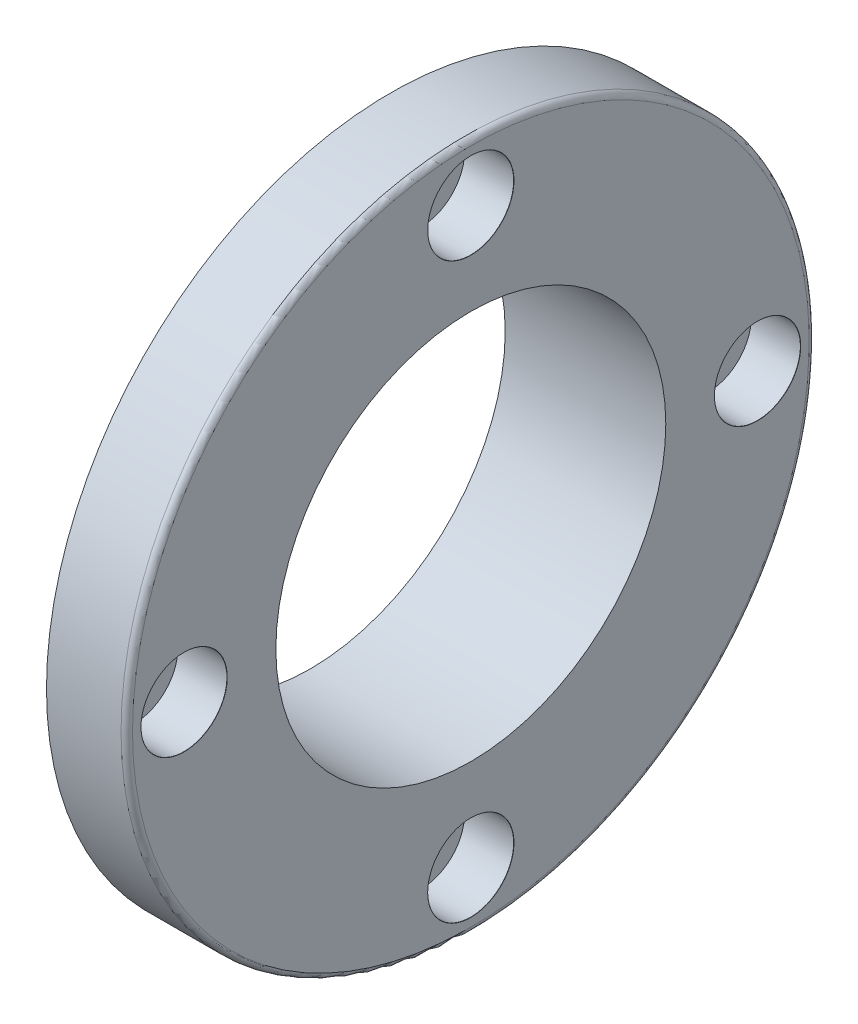
ISO-10303-21;
HEADER;
FILE_DESCRIPTION(('STEP AP214'),'2;1');
FILE_NAME('part.step','',(''),(''),'','','');
FILE_SCHEMA(('AUTOMOTIVE_DESIGN { 1 0 10303 214 1 1 1 1 }'));
ENDSEC;
DATA;
#1=APPLICATION_CONTEXT('core data for automotive mechanical design processes');
#2=APPLICATION_PROTOCOL_DEFINITION('international standard','automotive_design',2000,#1);
#3=PRODUCT_CONTEXT('',#1,'mechanical');
#4=PRODUCT('Part','Part','',(#3));
#5=PRODUCT_RELATED_PRODUCT_CATEGORY('part','',(#4));
#6=PRODUCT_DEFINITION_FORMATION('','',#4);
#7=PRODUCT_DEFINITION_CONTEXT('part definition',#1,'design');
#8=PRODUCT_DEFINITION('design','',#6,#7);
#9=PRODUCT_DEFINITION_SHAPE('','',#8);
#10=(LENGTH_UNIT() NAMED_UNIT(*) SI_UNIT(.MILLI.,.METRE.));
#11=(NAMED_UNIT(*) PLANE_ANGLE_UNIT() SI_UNIT($,.RADIAN.));
#12=(NAMED_UNIT(*) SI_UNIT($,.STERADIAN.) SOLID_ANGLE_UNIT());
#13=UNCERTAINTY_MEASURE_WITH_UNIT(LENGTH_MEASURE(1.E-05),#10,'distance_accuracy_value','');
#14=(GEOMETRIC_REPRESENTATION_CONTEXT(3) GLOBAL_UNCERTAINTY_ASSIGNED_CONTEXT((#13)) GLOBAL_UNIT_ASSIGNED_CONTEXT((#10,
#11,#12)) REPRESENTATION_CONTEXT('',''));
#15=CARTESIAN_POINT('',(0.,0.,0.));
#16=DIRECTION('',(0.,0.,1.));
#17=DIRECTION('',(1.,0.,0.));
#18=AXIS2_PLACEMENT_3D('',#15,#16,#17);
#19=CARTESIAN_POINT('',(81.5758451113917,34.,0.));
#20=DIRECTION('',(1.,0.,0.));
#21=DIRECTION('',(0.,0.,-1.));
#22=AXIS2_PLACEMENT_3D('',#19,#20,#21);
#23=PLANE('',#22);
#24=CARTESIAN_POINT('',(81.5758451113917,0.,0.));
#25=DIRECTION('',(1.,0.,0.));
#26=DIRECTION('',(0.,0.,-1.));
#27=AXIS2_PLACEMENT_3D('',#24,#25,#26);
#28=CIRCLE('',#27,39.5);
#29=CARTESIAN_POINT('',(81.5758451113917,0.,-39.5));
#30=VERTEX_POINT('',#29);
#31=EDGE_CURVE('E43',#30,#30,#28,.F.);
#32=ORIENTED_EDGE('',*,*,#31,.T.);
#33=EDGE_LOOP('',(#32));
#34=FACE_BOUND('',#33,.T.);
#35=CARTESIAN_POINT('',(81.5758451113917,0.,0.));
#36=DIRECTION('',(-1.,0.,0.));
#37=DIRECTION('',(0.,0.,1.));
#38=AXIS2_PLACEMENT_3D('',#35,#36,#37);
#39=CIRCLE('',#38,34.);
#40=CARTESIAN_POINT('',(81.5758451113917,0.,34.));
#41=VERTEX_POINT('',#40);
#42=EDGE_CURVE('E64',#41,#41,#39,.T.);
#43=ORIENTED_EDGE('',*,*,#42,.F.);
#44=EDGE_LOOP('',(#43));
#45=FACE_BOUND('',#44,.T.);
#46=ADVANCED_FACE('F35',(#34,#45),#23,.F.);
#47=CARTESIAN_POINT('',(0.,0.,0.));
#48=DIRECTION('',(-1.,0.,0.));
#49=DIRECTION('',(0.,0.,1.));
#50=AXIS2_PLACEMENT_3D('',#47,#48,#49);
#51=CYLINDRICAL_SURFACE('',#50,40.);
#52=CARTESIAN_POINT('',(82.0758451113917,0.,0.));
#53=DIRECTION('',(1.,0.,0.));
#54=DIRECTION('',(0.,0.,-1.));
#55=AXIS2_PLACEMENT_3D('',#52,#53,#54);
#56=CIRCLE('',#55,40.);
#57=CARTESIAN_POINT('',(82.0758451113917,0.,-40.));
#58=VERTEX_POINT('',#57);
#59=EDGE_CURVE('E10',#58,#58,#56,.T.);
#60=ORIENTED_EDGE('',*,*,#59,.T.);
#61=EDGE_LOOP('',(#60));
#62=FACE_BOUND('',#61,.T.);
#63=CARTESIAN_POINT('',(95.5758451113917,0.,0.));
#64=DIRECTION('',(-1.,0.,0.));
#65=DIRECTION('',(0.,0.,1.));
#66=AXIS2_PLACEMENT_3D('',#63,#64,#65);
#67=CIRCLE('',#66,40.);
#68=CARTESIAN_POINT('',(95.5758451113917,0.,40.));
#69=VERTEX_POINT('',#68);
#70=EDGE_CURVE('E55',#69,#69,#67,.T.);
#71=ORIENTED_EDGE('',*,*,#70,.T.);
#72=EDGE_LOOP('',(#71));
#73=FACE_BOUND('',#72,.T.);
#74=ADVANCED_FACE('F150',(#62,#73),#51,.T.);
#75=CARTESIAN_POINT('',(95.5758451113917,40.,0.));
#76=DIRECTION('',(1.,0.,0.));
#77=DIRECTION('',(0.,0.,-1.));
#78=AXIS2_PLACEMENT_3D('',#75,#76,#77);
#79=PLANE('',#78);
#80=CARTESIAN_POINT('',(95.5758451113917,-1.74574066942157E-13,-50.));
#81=DIRECTION('',(1.,0.,0.));
#82=DIRECTION('',(0.,-1.,0.));
#83=AXIS2_PLACEMENT_3D('',#80,#81,#82);
#84=CIRCLE('',#83,4.49999999999999);
#85=CARTESIAN_POINT('',(95.5758451113917,-4.50000000000017,-50.));
#86=VERTEX_POINT('',#85);
#87=EDGE_CURVE('E119',#86,#86,#84,.T.);
#88=ORIENTED_EDGE('',*,*,#87,.T.);
#89=EDGE_LOOP('',(#88));
#90=FACE_BOUND('',#89,.T.);
#91=CARTESIAN_POINT('',(95.5758451113917,-50.,0.));
#92=DIRECTION('',(1.,0.,0.));
#93=DIRECTION('',(0.,0.,1.));
#94=AXIS2_PLACEMENT_3D('',#91,#92,#93);
#95=CIRCLE('',#94,4.49999999999999);
#96=CARTESIAN_POINT('',(95.5758451113917,-50.,4.49999999999999));
#97=VERTEX_POINT('',#96);
#98=EDGE_CURVE('E106',#97,#97,#95,.T.);
#99=ORIENTED_EDGE('',*,*,#98,.T.);
#100=EDGE_LOOP('',(#99));
#101=FACE_BOUND('',#100,.T.);
#102=CARTESIAN_POINT('',(95.5758451113917,5.2372220082647E-13,50.));
#103=DIRECTION('',(1.,0.,0.));
#104=DIRECTION('',(0.,1.,0.));
#105=AXIS2_PLACEMENT_3D('',#102,#103,#104);
#106=CIRCLE('',#105,4.49999999999999);
#107=CARTESIAN_POINT('',(95.5758451113917,4.50000000000052,50.));
#108=VERTEX_POINT('',#107);
#109=EDGE_CURVE('E90',#108,#108,#106,.T.);
#110=ORIENTED_EDGE('',*,*,#109,.T.);
#111=EDGE_LOOP('',(#110));
#112=FACE_BOUND('',#111,.T.);
#113=CARTESIAN_POINT('',(95.5758451113917,50.,0.));
#114=DIRECTION('',(1.,0.,0.));
#115=DIRECTION('',(0.,0.,-1.));
#116=AXIS2_PLACEMENT_3D('',#113,#114,#115);
#117=CIRCLE('',#116,4.49999999999999);
#118=CARTESIAN_POINT('',(95.5758451113917,50.,-4.49999999999999));
#119=VERTEX_POINT('',#118);
#120=EDGE_CURVE('E39',#119,#119,#117,.T.);
#121=ORIENTED_EDGE('',*,*,#120,.T.);
#122=EDGE_LOOP('',(#121));
#123=FACE_BOUND('',#122,.T.);
#124=ORIENTED_EDGE('',*,*,#70,.F.);
#125=EDGE_LOOP('',(#124));
#126=FACE_BOUND('',#125,.T.);
#127=CARTESIAN_POINT('',(95.5758451113917,0.,0.));
#128=DIRECTION('',(-1.,0.,0.));
#129=DIRECTION('',(0.,0.,1.));
#130=AXIS2_PLACEMENT_3D('',#127,#128,#129);
#131=CIRCLE('',#130,60.);
#132=CARTESIAN_POINT('',(95.5758451113917,0.,60.));
#133=VERTEX_POINT('',#132);
#134=EDGE_CURVE('E58',#133,#133,#131,.T.);
#135=ORIENTED_EDGE('',*,*,#134,.T.);
#136=EDGE_LOOP('',(#135));
#137=FACE_BOUND('',#136,.T.);
#138=ADVANCED_FACE('F156',(#90,#101,#112,#123,#126,#137),#79,.F.);
#139=CARTESIAN_POINT('',(0.,0.,0.));
#140=DIRECTION('',(-1.,0.,0.));
#141=DIRECTION('',(0.,0.,1.));
#142=AXIS2_PLACEMENT_3D('',#139,#140,#141);
#143=CYLINDRICAL_SURFACE('',#142,60.);
#144=CARTESIAN_POINT('',(108.575845111392,0.,0.));
#145=DIRECTION('',(-1.,0.,0.));
#146=DIRECTION('',(0.,0.,1.));
#147=AXIS2_PLACEMENT_3D('',#144,#145,#146);
#148=CIRCLE('',#147,60.);
#149=CARTESIAN_POINT('',(108.575845111392,0.,60.));
#150=VERTEX_POINT('',#149);
#151=EDGE_CURVE('E52',#150,#150,#148,.T.);
#152=ORIENTED_EDGE('',*,*,#151,.T.);
#153=EDGE_LOOP('',(#152));
#154=FACE_BOUND('',#153,.T.);
#155=ORIENTED_EDGE('',*,*,#134,.F.);
#156=EDGE_LOOP('',(#155));
#157=FACE_BOUND('',#156,.T.);
#158=ADVANCED_FACE('F131',(#154,#157),#143,.T.);
#159=CARTESIAN_POINT('',(109.575845111392,60.,0.));
#160=DIRECTION('',(-1.,0.,0.));
#161=DIRECTION('',(0.,0.,1.));
#162=AXIS2_PLACEMENT_3D('',#159,#160,#161);
#163=PLANE('',#162);
#164=CARTESIAN_POINT('',(109.575845111392,-1.74574066942157E-13,-50.));
#165=DIRECTION('',(1.,0.,0.));
#166=DIRECTION('',(0.,-1.,0.));
#167=AXIS2_PLACEMENT_3D('',#164,#165,#166);
#168=CIRCLE('',#167,7.525);
#169=CARTESIAN_POINT('',(109.575845111392,-7.52500000000018,-50.));
#170=VERTEX_POINT('',#169);
#171=EDGE_CURVE('E99',#170,#170,#168,.T.);
#172=ORIENTED_EDGE('',*,*,#171,.F.);
#173=EDGE_LOOP('',(#172));
#174=FACE_BOUND('',#173,.T.);
#175=CARTESIAN_POINT('',(109.575845111392,-50.,0.));
#176=DIRECTION('',(1.,0.,0.));
#177=DIRECTION('',(0.,0.,1.));
#178=AXIS2_PLACEMENT_3D('',#175,#176,#177);
#179=CIRCLE('',#178,7.525);
#180=CARTESIAN_POINT('',(109.575845111392,-50.,7.525));
#181=VERTEX_POINT('',#180);
#182=EDGE_CURVE('E83',#181,#181,#179,.T.);
#183=ORIENTED_EDGE('',*,*,#182,.F.);
#184=EDGE_LOOP('',(#183));
#185=FACE_BOUND('',#184,.T.);
#186=CARTESIAN_POINT('',(109.575845111392,5.2372220082647E-13,50.));
#187=DIRECTION('',(1.,0.,0.));
#188=DIRECTION('',(0.,1.,0.));
#189=AXIS2_PLACEMENT_3D('',#186,#187,#188);
#190=CIRCLE('',#189,7.525);
#191=CARTESIAN_POINT('',(109.575845111392,7.52500000000053,49.9999999999999));
#192=VERTEX_POINT('',#191);
#193=EDGE_CURVE('E93',#192,#192,#190,.T.);
#194=ORIENTED_EDGE('',*,*,#193,.F.);
#195=EDGE_LOOP('',(#194));
#196=FACE_BOUND('',#195,.T.);
#197=CARTESIAN_POINT('',(109.575845111392,50.,0.));
#198=DIRECTION('',(1.,0.,0.));
#199=DIRECTION('',(0.,0.,-1.));
#200=AXIS2_PLACEMENT_3D('',#197,#198,#199);
#201=CIRCLE('',#200,7.525);
#202=CARTESIAN_POINT('',(109.575845111392,50.,-7.525));
#203=VERTEX_POINT('',#202);
#204=EDGE_CURVE('E76',#203,#203,#201,.T.);
#205=ORIENTED_EDGE('',*,*,#204,.F.);
#206=EDGE_LOOP('',(#205));
#207=FACE_BOUND('',#206,.T.);
#208=CARTESIAN_POINT('',(109.575845111392,0.,0.));
#209=DIRECTION('',(-1.,0.,0.));
#210=DIRECTION('',(0.,0.,1.));
#211=AXIS2_PLACEMENT_3D('',#208,#209,#210);
#212=CIRCLE('',#211,59.);
#213=CARTESIAN_POINT('',(109.575845111392,0.,59.));
#214=VERTEX_POINT('',#213);
#215=EDGE_CURVE('E47',#214,#214,#212,.F.);
#216=ORIENTED_EDGE('',*,*,#215,.T.);
#217=EDGE_LOOP('',(#216));
#218=FACE_BOUND('',#217,.T.);
#219=CARTESIAN_POINT('',(109.575845111392,0.,0.));
#220=DIRECTION('',(-1.,0.,0.));
#221=DIRECTION('',(0.,0.,1.));
#222=AXIS2_PLACEMENT_3D('',#219,#220,#221);
#223=CIRCLE('',#222,34.);
#224=CARTESIAN_POINT('',(109.575845111392,0.,34.));
#225=VERTEX_POINT('',#224);
#226=EDGE_CURVE('E61',#225,#225,#223,.T.);
#227=ORIENTED_EDGE('',*,*,#226,.T.);
#228=EDGE_LOOP('',(#227));
#229=FACE_BOUND('',#228,.T.);
#230=ADVANCED_FACE('F127',(#174,#185,#196,#207,#218,#229),#163,.F.);
#231=CARTESIAN_POINT('',(0.,0.,0.));
#232=DIRECTION('',(-1.,0.,0.));
#233=DIRECTION('',(0.,0.,1.));
#234=AXIS2_PLACEMENT_3D('',#231,#232,#233);
#235=CYLINDRICAL_SURFACE('',#234,34.);
#236=ORIENTED_EDGE('',*,*,#226,.F.);
#237=EDGE_LOOP('',(#236));
#238=FACE_BOUND('',#237,.T.);
#239=ORIENTED_EDGE('',*,*,#42,.T.);
#240=EDGE_LOOP('',(#239));
#241=FACE_BOUND('',#240,.T.);
#242=ADVANCED_FACE('F130',(#238,#241),#235,.F.);
#243=CARTESIAN_POINT('',(108.575845111392,0.,0.));
#244=DIRECTION('',(-1.,0.,0.));
#245=DIRECTION('',(0.,0.,1.));
#246=AXIS2_PLACEMENT_3D('',#243,#244,#245);
#247=TOROIDAL_SURFACE('',#246,59.,1.);
#248=ORIENTED_EDGE('',*,*,#215,.F.);
#249=EDGE_LOOP('',(#248));
#250=FACE_BOUND('',#249,.T.);
#251=ORIENTED_EDGE('',*,*,#151,.F.);
#252=EDGE_LOOP('',(#251));
#253=FACE_BOUND('',#252,.T.);
#254=ADVANCED_FACE('F145',(#250,#253),#247,.T.);
#255=CARTESIAN_POINT('',(81.5758451113917,0.,0.));
#256=DIRECTION('',(1.,0.,0.));
#257=DIRECTION('',(0.,0.,-1.));
#258=AXIS2_PLACEMENT_3D('',#255,#256,#257);
#259=CONICAL_SURFACE('',#258,39.5,0.785398163397448);
#260=ORIENTED_EDGE('',*,*,#59,.F.);
#261=EDGE_LOOP('',(#260));
#262=FACE_BOUND('',#261,.T.);
#263=ORIENTED_EDGE('',*,*,#31,.F.);
#264=EDGE_LOOP('',(#263));
#265=FACE_BOUND('',#264,.T.);
#266=ADVANCED_FACE('F37',(#262,#265),#259,.T.);
#267=CARTESIAN_POINT('',(109.575845111392,50.,0.));
#268=DIRECTION('',(1.,0.,0.));
#269=DIRECTION('',(0.,0.,-1.));
#270=AXIS2_PLACEMENT_3D('',#267,#268,#269);
#271=CYLINDRICAL_SURFACE('',#270,4.49999999999999);
#272=CARTESIAN_POINT('',(100.975845111392,50.,0.));
#273=DIRECTION('',(1.,0.,0.));
#274=DIRECTION('',(0.,0.,-1.));
#275=AXIS2_PLACEMENT_3D('',#272,#273,#274);
#276=CIRCLE('',#275,4.5);
#277=CARTESIAN_POINT('',(100.975845111392,50.,-4.5));
#278=VERTEX_POINT('',#277);
#279=EDGE_CURVE('E67',#278,#278,#276,.T.);
#280=ORIENTED_EDGE('',*,*,#279,.T.);
#281=EDGE_LOOP('',(#280));
#282=FACE_BOUND('',#281,.T.);
#283=ORIENTED_EDGE('',*,*,#120,.F.);
#284=EDGE_LOOP('',(#283));
#285=FACE_BOUND('',#284,.T.);
#286=ADVANCED_FACE('F164',(#282,#285),#271,.F.);
#287=CARTESIAN_POINT('',(100.975845111392,57.5,0.));
#288=DIRECTION('',(-1.,0.,0.));
#289=DIRECTION('',(0.,0.,1.));
#290=AXIS2_PLACEMENT_3D('',#287,#288,#289);
#291=PLANE('',#290);
#292=ORIENTED_EDGE('',*,*,#279,.F.);
#293=EDGE_LOOP('',(#292));
#294=FACE_BOUND('',#293,.T.);
#295=CARTESIAN_POINT('',(100.975845111392,50.,0.));
#296=DIRECTION('',(1.,0.,0.));
#297=DIRECTION('',(0.,0.,-1.));
#298=AXIS2_PLACEMENT_3D('',#295,#296,#297);
#299=CIRCLE('',#298,7.49999999999999);
#300=CARTESIAN_POINT('',(100.975845111392,50.,-7.49999999999999));
#301=VERTEX_POINT('',#300);
#302=EDGE_CURVE('E70',#301,#301,#299,.T.);
#303=ORIENTED_EDGE('',*,*,#302,.T.);
#304=EDGE_LOOP('',(#303));
#305=FACE_BOUND('',#304,.T.);
#306=ADVANCED_FACE('F182',(#294,#305),#291,.F.);
#307=CARTESIAN_POINT('',(109.575845111392,50.,0.));
#308=DIRECTION('',(1.,0.,0.));
#309=DIRECTION('',(0.,0.,-1.));
#310=AXIS2_PLACEMENT_3D('',#307,#308,#309);
#311=CYLINDRICAL_SURFACE('',#310,7.5);
#312=ORIENTED_EDGE('',*,*,#302,.F.);
#313=EDGE_LOOP('',(#312));
#314=FACE_BOUND('',#313,.T.);
#315=CARTESIAN_POINT('',(109.550845111392,50.,0.));
#316=DIRECTION('',(1.,0.,0.));
#317=DIRECTION('',(0.,0.,-1.));
#318=AXIS2_PLACEMENT_3D('',#315,#316,#317);
#319=CIRCLE('',#318,7.5);
#320=CARTESIAN_POINT('',(109.550845111392,50.,-7.5));
#321=VERTEX_POINT('',#320);
#322=EDGE_CURVE('E73',#321,#321,#319,.T.);
#323=ORIENTED_EDGE('',*,*,#322,.T.);
#324=EDGE_LOOP('',(#323));
#325=FACE_BOUND('',#324,.T.);
#326=ADVANCED_FACE('F186',(#314,#325),#311,.F.);
#327=CARTESIAN_POINT('',(109.575845111392,50.,0.));
#328=DIRECTION('',(1.,0.,0.));
#329=DIRECTION('',(0.,0.,-1.));
#330=AXIS2_PLACEMENT_3D('',#327,#328,#329);
#331=CONICAL_SURFACE('',#330,7.525,0.785398163397587);
#332=ORIENTED_EDGE('',*,*,#322,.F.);
#333=EDGE_LOOP('',(#332));
#334=FACE_BOUND('',#333,.T.);
#335=ORIENTED_EDGE('',*,*,#204,.T.);
#336=EDGE_LOOP('',(#335));
#337=FACE_BOUND('',#336,.T.);
#338=ADVANCED_FACE('F190',(#334,#337),#331,.F.);
#339=CARTESIAN_POINT('',(109.575845111392,5.2372220082647E-13,50.));
#340=DIRECTION('',(1.,0.,0.));
#341=DIRECTION('',(0.,1.,0.));
#342=AXIS2_PLACEMENT_3D('',#339,#340,#341);
#343=CYLINDRICAL_SURFACE('',#342,4.49999999999999);
#344=CARTESIAN_POINT('',(100.975845111392,5.2372220082647E-13,50.));
#345=DIRECTION('',(1.,0.,0.));
#346=DIRECTION('',(0.,1.,0.));
#347=AXIS2_PLACEMENT_3D('',#344,#345,#346);
#348=CIRCLE('',#347,4.5);
#349=CARTESIAN_POINT('',(100.975845111392,4.50000000000052,50.));
#350=VERTEX_POINT('',#349);
#351=EDGE_CURVE('E80',#350,#350,#348,.T.);
#352=ORIENTED_EDGE('',*,*,#351,.T.);
#353=EDGE_LOOP('',(#352));
#354=FACE_BOUND('',#353,.T.);
#355=ORIENTED_EDGE('',*,*,#109,.F.);
#356=EDGE_LOOP('',(#355));
#357=FACE_BOUND('',#356,.T.);
#358=ADVANCED_FACE('F194',(#354,#357),#343,.F.);
#359=CARTESIAN_POINT('',(100.975845111392,6.0228053095044E-13,57.5));
#360=DIRECTION('',(-1.,0.,0.));
#361=DIRECTION('',(0.,-1.,0.));
#362=AXIS2_PLACEMENT_3D('',#359,#360,#361);
#363=PLANE('',#362);
#364=ORIENTED_EDGE('',*,*,#351,.F.);
#365=EDGE_LOOP('',(#364));
#366=FACE_BOUND('',#365,.T.);
#367=CARTESIAN_POINT('',(100.975845111392,5.2372220082647E-13,50.));
#368=DIRECTION('',(1.,0.,0.));
#369=DIRECTION('',(0.,1.,0.));
#370=AXIS2_PLACEMENT_3D('',#367,#368,#369);
#371=CIRCLE('',#370,7.49999999999999);
#372=CARTESIAN_POINT('',(100.975845111392,7.50000000000052,49.9999999999999));
#373=VERTEX_POINT('',#372);
#374=EDGE_CURVE('E84',#373,#373,#371,.T.);
#375=ORIENTED_EDGE('',*,*,#374,.T.);
#376=EDGE_LOOP('',(#375));
#377=FACE_BOUND('',#376,.T.);
#378=ADVANCED_FACE('F198',(#366,#377),#363,.F.);
#379=CARTESIAN_POINT('',(109.575845111392,5.2372220082647E-13,50.));
#380=DIRECTION('',(1.,0.,0.));
#381=DIRECTION('',(0.,1.,0.));
#382=AXIS2_PLACEMENT_3D('',#379,#380,#381);
#383=CYLINDRICAL_SURFACE('',#382,7.5);
#384=ORIENTED_EDGE('',*,*,#374,.F.);
#385=EDGE_LOOP('',(#384));
#386=FACE_BOUND('',#385,.T.);
#387=CARTESIAN_POINT('',(109.550845111392,5.2372220082647E-13,50.));
#388=DIRECTION('',(1.,0.,0.));
#389=DIRECTION('',(0.,1.,0.));
#390=AXIS2_PLACEMENT_3D('',#387,#388,#389);
#391=CIRCLE('',#390,7.5);
#392=CARTESIAN_POINT('',(109.550845111392,7.50000000000052,49.9999999999999));
#393=VERTEX_POINT('',#392);
#394=EDGE_CURVE('E87',#393,#393,#391,.T.);
#395=ORIENTED_EDGE('',*,*,#394,.T.);
#396=EDGE_LOOP('',(#395));
#397=FACE_BOUND('',#396,.T.);
#398=ADVANCED_FACE('F202',(#386,#397),#383,.F.);
#399=CARTESIAN_POINT('',(109.575845111392,5.2372220082647E-13,50.));
#400=DIRECTION('',(1.,0.,0.));
#401=DIRECTION('',(0.,1.,0.));
#402=AXIS2_PLACEMENT_3D('',#399,#400,#401);
#403=CONICAL_SURFACE('',#402,7.525,0.785398163397587);
#404=ORIENTED_EDGE('',*,*,#394,.F.);
#405=EDGE_LOOP('',(#404));
#406=FACE_BOUND('',#405,.T.);
#407=ORIENTED_EDGE('',*,*,#193,.T.);
#408=EDGE_LOOP('',(#407));
#409=FACE_BOUND('',#408,.T.);
#410=ADVANCED_FACE('F206',(#406,#409),#403,.F.);
#411=CARTESIAN_POINT('',(109.575845111392,-50.,0.));
#412=DIRECTION('',(1.,0.,0.));
#413=DIRECTION('',(0.,0.,1.));
#414=AXIS2_PLACEMENT_3D('',#411,#412,#413);
#415=CYLINDRICAL_SURFACE('',#414,4.49999999999999);
#416=CARTESIAN_POINT('',(100.975845111392,-50.,0.));
#417=DIRECTION('',(1.,0.,0.));
#418=DIRECTION('',(0.,0.,1.));
#419=AXIS2_PLACEMENT_3D('',#416,#417,#418);
#420=CIRCLE('',#419,4.5);
#421=CARTESIAN_POINT('',(100.975845111392,-50.,4.5));
#422=VERTEX_POINT('',#421);
#423=EDGE_CURVE('E96',#422,#422,#420,.T.);
#424=ORIENTED_EDGE('',*,*,#423,.T.);
#425=EDGE_LOOP('',(#424));
#426=FACE_BOUND('',#425,.T.);
#427=ORIENTED_EDGE('',*,*,#98,.F.);
#428=EDGE_LOOP('',(#427));
#429=FACE_BOUND('',#428,.T.);
#430=ADVANCED_FACE('F210',(#426,#429),#415,.F.);
#431=CARTESIAN_POINT('',(100.975845111392,-57.5,0.));
#432=DIRECTION('',(-1.,0.,0.));
#433=DIRECTION('',(0.,0.,-1.));
#434=AXIS2_PLACEMENT_3D('',#431,#432,#433);
#435=PLANE('',#434);
#436=ORIENTED_EDGE('',*,*,#423,.F.);
#437=EDGE_LOOP('',(#436));
#438=FACE_BOUND('',#437,.T.);
#439=CARTESIAN_POINT('',(100.975845111392,-50.,0.));
#440=DIRECTION('',(1.,0.,0.));
#441=DIRECTION('',(0.,0.,1.));
#442=AXIS2_PLACEMENT_3D('',#439,#440,#441);
#443=CIRCLE('',#442,7.49999999999999);
#444=CARTESIAN_POINT('',(100.975845111392,-50.,7.49999999999999));
#445=VERTEX_POINT('',#444);
#446=EDGE_CURVE('E100',#445,#445,#443,.T.);
#447=ORIENTED_EDGE('',*,*,#446,.T.);
#448=EDGE_LOOP('',(#447));
#449=FACE_BOUND('',#448,.T.);
#450=ADVANCED_FACE('F214',(#438,#449),#435,.F.);
#451=CARTESIAN_POINT('',(109.575845111392,-50.,0.));
#452=DIRECTION('',(1.,0.,0.));
#453=DIRECTION('',(0.,0.,1.));
#454=AXIS2_PLACEMENT_3D('',#451,#452,#453);
#455=CYLINDRICAL_SURFACE('',#454,7.5);
#456=ORIENTED_EDGE('',*,*,#446,.F.);
#457=EDGE_LOOP('',(#456));
#458=FACE_BOUND('',#457,.T.);
#459=CARTESIAN_POINT('',(109.550845111392,-50.,0.));
#460=DIRECTION('',(1.,0.,0.));
#461=DIRECTION('',(0.,0.,1.));
#462=AXIS2_PLACEMENT_3D('',#459,#460,#461);
#463=CIRCLE('',#462,7.5);
#464=CARTESIAN_POINT('',(109.550845111392,-50.,7.5));
#465=VERTEX_POINT('',#464);
#466=EDGE_CURVE('E103',#465,#465,#463,.T.);
#467=ORIENTED_EDGE('',*,*,#466,.T.);
#468=EDGE_LOOP('',(#467));
#469=FACE_BOUND('',#468,.T.);
#470=ADVANCED_FACE('F218',(#458,#469),#455,.F.);
#471=CARTESIAN_POINT('',(109.575845111392,-50.,0.));
#472=DIRECTION('',(1.,0.,0.));
#473=DIRECTION('',(0.,0.,1.));
#474=AXIS2_PLACEMENT_3D('',#471,#472,#473);
#475=CONICAL_SURFACE('',#474,7.525,0.785398163397587);
#476=ORIENTED_EDGE('',*,*,#466,.F.);
#477=EDGE_LOOP('',(#476));
#478=FACE_BOUND('',#477,.T.);
#479=ORIENTED_EDGE('',*,*,#182,.T.);
#480=EDGE_LOOP('',(#479));
#481=FACE_BOUND('',#480,.T.);
#482=ADVANCED_FACE('F222',(#478,#481),#475,.F.);
#483=CARTESIAN_POINT('',(109.575845111392,-1.74574066942157E-13,-50.));
#484=DIRECTION('',(1.,0.,0.));
#485=DIRECTION('',(0.,-1.,0.));
#486=AXIS2_PLACEMENT_3D('',#483,#484,#485);
#487=CYLINDRICAL_SURFACE('',#486,4.49999999999999);
#488=CARTESIAN_POINT('',(100.975845111392,-1.74574066942157E-13,-50.));
#489=DIRECTION('',(1.,0.,0.));
#490=DIRECTION('',(0.,-1.,0.));
#491=AXIS2_PLACEMENT_3D('',#488,#489,#490);
#492=CIRCLE('',#491,4.5);
#493=CARTESIAN_POINT('',(100.975845111392,-4.50000000000017,-50.));
#494=VERTEX_POINT('',#493);
#495=EDGE_CURVE('E79',#494,#494,#492,.T.);
#496=ORIENTED_EDGE('',*,*,#495,.T.);
#497=EDGE_LOOP('',(#496));
#498=FACE_BOUND('',#497,.T.);
#499=ORIENTED_EDGE('',*,*,#87,.F.);
#500=EDGE_LOOP('',(#499));
#501=FACE_BOUND('',#500,.T.);
#502=ADVANCED_FACE('F226',(#498,#501),#487,.F.);
#503=CARTESIAN_POINT('',(100.975845111392,-2.0076017698348E-13,-57.5));
#504=DIRECTION('',(-1.,0.,0.));
#505=DIRECTION('',(0.,1.,0.));
#506=AXIS2_PLACEMENT_3D('',#503,#504,#505);
#507=PLANE('',#506);
#508=ORIENTED_EDGE('',*,*,#495,.F.);
#509=EDGE_LOOP('',(#508));
#510=FACE_BOUND('',#509,.T.);
#511=CARTESIAN_POINT('',(100.975845111392,-1.74574066942157E-13,-50.));
#512=DIRECTION('',(1.,0.,0.));
#513=DIRECTION('',(0.,-1.,0.));
#514=AXIS2_PLACEMENT_3D('',#511,#512,#513);
#515=CIRCLE('',#514,7.49999999999999);
#516=CARTESIAN_POINT('',(100.975845111392,-7.50000000000017,-50.));
#517=VERTEX_POINT('',#516);
#518=EDGE_CURVE('E113',#517,#517,#515,.T.);
#519=ORIENTED_EDGE('',*,*,#518,.T.);
#520=EDGE_LOOP('',(#519));
#521=FACE_BOUND('',#520,.T.);
#522=ADVANCED_FACE('F230',(#510,#521),#507,.F.);
#523=CARTESIAN_POINT('',(109.575845111392,-1.74574066942157E-13,-50.));
#524=DIRECTION('',(1.,0.,0.));
#525=DIRECTION('',(0.,-1.,0.));
#526=AXIS2_PLACEMENT_3D('',#523,#524,#525);
#527=CYLINDRICAL_SURFACE('',#526,7.5);
#528=ORIENTED_EDGE('',*,*,#518,.F.);
#529=EDGE_LOOP('',(#528));
#530=FACE_BOUND('',#529,.T.);
#531=CARTESIAN_POINT('',(109.550845111392,-1.74574066942157E-13,-50.));
#532=DIRECTION('',(1.,0.,0.));
#533=DIRECTION('',(0.,-1.,0.));
#534=AXIS2_PLACEMENT_3D('',#531,#532,#533);
#535=CIRCLE('',#534,7.5);
#536=CARTESIAN_POINT('',(109.550845111392,-7.50000000000017,-50.));
#537=VERTEX_POINT('',#536);
#538=EDGE_CURVE('E116',#537,#537,#535,.T.);
#539=ORIENTED_EDGE('',*,*,#538,.T.);
#540=EDGE_LOOP('',(#539));
#541=FACE_BOUND('',#540,.T.);
#542=ADVANCED_FACE('F234',(#530,#541),#527,.F.);
#543=CARTESIAN_POINT('',(109.575845111392,-1.74574066942157E-13,-50.));
#544=DIRECTION('',(1.,0.,0.));
#545=DIRECTION('',(0.,-1.,0.));
#546=AXIS2_PLACEMENT_3D('',#543,#544,#545);
#547=CONICAL_SURFACE('',#546,7.525,0.785398163397587);
#548=ORIENTED_EDGE('',*,*,#538,.F.);
#549=EDGE_LOOP('',(#548));
#550=FACE_BOUND('',#549,.T.);
#551=ORIENTED_EDGE('',*,*,#171,.T.);
#552=EDGE_LOOP('',(#551));
#553=FACE_BOUND('',#552,.T.);
#554=ADVANCED_FACE('F125',(#550,#553),#547,.F.);
#555=CLOSED_SHELL('',(#46,#74,#138,#158,#230,#242,#254,#266,#286,#306,#326,#338,#358,#378,#398,
#410,#430,#450,#470,#482,#502,#522,#542,#554));
#556=MANIFOLD_SOLID_BREP('B2',#555);
#557=ADVANCED_BREP_SHAPE_REPRESENTATION('',(#18,#556),#14);
#558=SHAPE_DEFINITION_REPRESENTATION(#9,#557);
ENDSEC;
END-ISO-10303-21;
